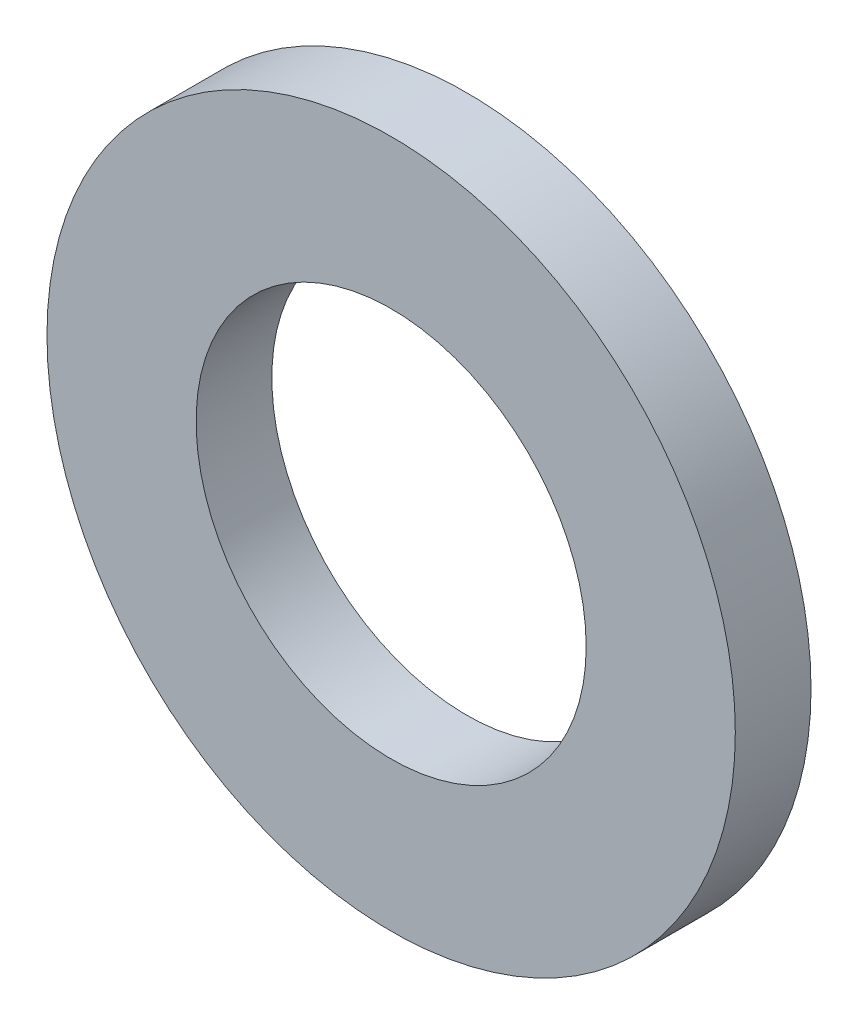
ISO-10303-21;
HEADER;
FILE_DESCRIPTION(('STEP AP214'),'2;1');
FILE_NAME('part.step','',(''),(''),'','','');
FILE_SCHEMA(('AUTOMOTIVE_DESIGN { 1 0 10303 214 1 1 1 1 }'));
ENDSEC;
DATA;
#1=APPLICATION_CONTEXT('core data for automotive mechanical design processes');
#2=APPLICATION_PROTOCOL_DEFINITION('international standard','automotive_design',2000,#1);
#3=PRODUCT_CONTEXT('',#1,'mechanical');
#4=PRODUCT('Part','Part','',(#3));
#5=PRODUCT_RELATED_PRODUCT_CATEGORY('part','',(#4));
#6=PRODUCT_DEFINITION_FORMATION('','',#4);
#7=PRODUCT_DEFINITION_CONTEXT('part definition',#1,'design');
#8=PRODUCT_DEFINITION('design','',#6,#7);
#9=PRODUCT_DEFINITION_SHAPE('','',#8);
#10=(LENGTH_UNIT() NAMED_UNIT(*) SI_UNIT(.MILLI.,.METRE.));
#11=(NAMED_UNIT(*) PLANE_ANGLE_UNIT() SI_UNIT($,.RADIAN.));
#12=(NAMED_UNIT(*) SI_UNIT($,.STERADIAN.) SOLID_ANGLE_UNIT());
#13=UNCERTAINTY_MEASURE_WITH_UNIT(LENGTH_MEASURE(1.E-05),#10,'distance_accuracy_value','');
#14=(GEOMETRIC_REPRESENTATION_CONTEXT(3) GLOBAL_UNCERTAINTY_ASSIGNED_CONTEXT((#13)) GLOBAL_UNIT_ASSIGNED_CONTEXT((#10,
#11,#12)) REPRESENTATION_CONTEXT('',''));
#15=CARTESIAN_POINT('',(0.,0.,0.));
#16=DIRECTION('',(0.,0.,1.));
#17=DIRECTION('',(1.,0.,0.));
#18=AXIS2_PLACEMENT_3D('',#15,#16,#17);
#19=CARTESIAN_POINT('',(0.,0.,3.3));
#20=DIRECTION('',(0.,0.,1.));
#21=DIRECTION('',(1.,0.,0.));
#22=AXIS2_PLACEMENT_3D('',#19,#20,#21);
#23=PLANE('',#22);
#24=CARTESIAN_POINT('',(0.,0.,3.3));
#25=DIRECTION('',(0.,0.,1.));
#26=DIRECTION('',(1.,0.,0.));
#27=AXIS2_PLACEMENT_3D('',#24,#25,#26);
#28=CIRCLE('',#27,15.);
#29=CARTESIAN_POINT('',(15.,0.,3.3));
#30=VERTEX_POINT('',#29);
#31=EDGE_CURVE('E10',#30,#30,#28,.T.);
#32=ORIENTED_EDGE('',*,*,#31,.T.);
#33=EDGE_LOOP('',(#32));
#34=FACE_BOUND('',#33,.T.);
#35=CARTESIAN_POINT('',(0.,0.,3.3));
#36=DIRECTION('',(0.,0.,1.));
#37=DIRECTION('',(1.,0.,0.));
#38=AXIS2_PLACEMENT_3D('',#35,#36,#37);
#39=CIRCLE('',#38,8.5);
#40=CARTESIAN_POINT('',(8.5,0.,3.3));
#41=VERTEX_POINT('',#40);
#42=EDGE_CURVE('E52',#41,#41,#39,.T.);
#43=ORIENTED_EDGE('',*,*,#42,.F.);
#44=EDGE_LOOP('',(#43));
#45=FACE_BOUND('',#44,.T.);
#46=ADVANCED_FACE('F39',(#34,#45),#23,.T.);
#47=CARTESIAN_POINT('',(0.,0.,0.));
#48=DIRECTION('',(0.,0.,1.));
#49=DIRECTION('',(1.,0.,0.));
#50=AXIS2_PLACEMENT_3D('',#47,#48,#49);
#51=PLANE('',#50);
#52=CARTESIAN_POINT('',(0.,0.,0.));
#53=DIRECTION('',(0.,0.,1.));
#54=DIRECTION('',(1.,0.,0.));
#55=AXIS2_PLACEMENT_3D('',#52,#53,#54);
#56=CIRCLE('',#55,15.);
#57=CARTESIAN_POINT('',(15.,0.,0.));
#58=VERTEX_POINT('',#57);
#59=EDGE_CURVE('E43',#58,#58,#56,.T.);
#60=ORIENTED_EDGE('',*,*,#59,.F.);
#61=EDGE_LOOP('',(#60));
#62=FACE_BOUND('',#61,.T.);
#63=CARTESIAN_POINT('',(0.,0.,0.));
#64=DIRECTION('',(0.,0.,1.));
#65=DIRECTION('',(1.,0.,0.));
#66=AXIS2_PLACEMENT_3D('',#63,#64,#65);
#67=CIRCLE('',#66,8.5);
#68=CARTESIAN_POINT('',(8.5,0.,0.));
#69=VERTEX_POINT('',#68);
#70=EDGE_CURVE('E54',#69,#69,#67,.T.);
#71=ORIENTED_EDGE('',*,*,#70,.T.);
#72=EDGE_LOOP('',(#71));
#73=FACE_BOUND('',#72,.T.);
#74=ADVANCED_FACE('F66',(#62,#73),#51,.F.);
#75=CARTESIAN_POINT('',(0.,0.,3.3));
#76=DIRECTION('',(0.,0.,-1.));
#77=DIRECTION('',(-1.,0.,0.));
#78=AXIS2_PLACEMENT_3D('',#75,#76,#77);
#79=CYLINDRICAL_SURFACE('',#78,15.);
#80=ORIENTED_EDGE('',*,*,#31,.F.);
#81=EDGE_LOOP('',(#80));
#82=FACE_BOUND('',#81,.T.);
#83=ORIENTED_EDGE('',*,*,#59,.T.);
#84=EDGE_LOOP('',(#83));
#85=FACE_BOUND('',#84,.T.);
#86=ADVANCED_FACE('F41',(#82,#85),#79,.T.);
#87=CARTESIAN_POINT('',(0.,0.,3.3));
#88=DIRECTION('',(0.,0.,-1.));
#89=DIRECTION('',(-1.,0.,0.));
#90=AXIS2_PLACEMENT_3D('',#87,#88,#89);
#91=CYLINDRICAL_SURFACE('',#90,8.5);
#92=ORIENTED_EDGE('',*,*,#42,.T.);
#93=EDGE_LOOP('',(#92));
#94=FACE_BOUND('',#93,.T.);
#95=ORIENTED_EDGE('',*,*,#70,.F.);
#96=EDGE_LOOP('',(#95));
#97=FACE_BOUND('',#96,.T.);
#98=ADVANCED_FACE('F62',(#94,#97),#91,.F.);
#99=CLOSED_SHELL('',(#46,#74,#86,#98));
#100=MANIFOLD_SOLID_BREP('B2',#99);
#101=ADVANCED_BREP_SHAPE_REPRESENTATION('',(#18,#100),#14);
#102=SHAPE_DEFINITION_REPRESENTATION(#9,#101);
ENDSEC;
END-ISO-10303-21;
